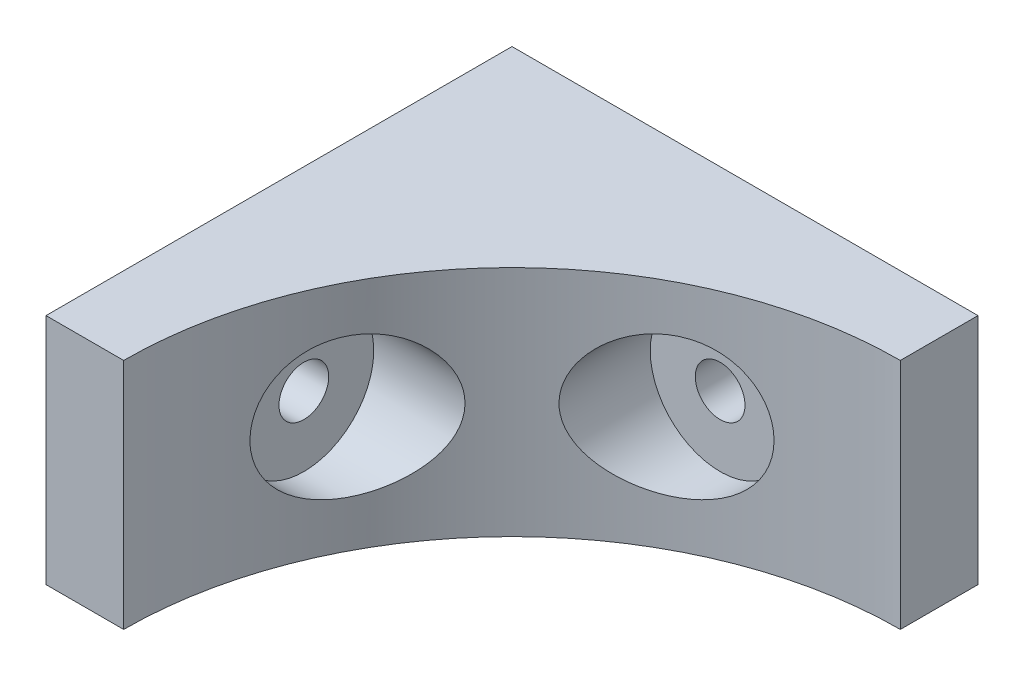
ISO-10303-21;
HEADER;
FILE_DESCRIPTION(('STEP AP214'),'2;1');
FILE_NAME('part.step','',(''),(''),'','','');
FILE_SCHEMA(('AUTOMOTIVE_DESIGN { 1 0 10303 214 1 1 1 1 }'));
ENDSEC;
DATA;
#1=APPLICATION_CONTEXT('core data for automotive mechanical design processes');
#2=APPLICATION_PROTOCOL_DEFINITION('international standard','automotive_design',2000,#1);
#3=PRODUCT_CONTEXT('',#1,'mechanical');
#4=PRODUCT('Part','Part','',(#3));
#5=PRODUCT_RELATED_PRODUCT_CATEGORY('part','',(#4));
#6=PRODUCT_DEFINITION_FORMATION('','',#4);
#7=PRODUCT_DEFINITION_CONTEXT('part definition',#1,'design');
#8=PRODUCT_DEFINITION('design','',#6,#7);
#9=PRODUCT_DEFINITION_SHAPE('','',#8);
#10=(LENGTH_UNIT() NAMED_UNIT(*) SI_UNIT(.MILLI.,.METRE.));
#11=(NAMED_UNIT(*) PLANE_ANGLE_UNIT() SI_UNIT($,.RADIAN.));
#12=(NAMED_UNIT(*) SI_UNIT($,.STERADIAN.) SOLID_ANGLE_UNIT());
#13=UNCERTAINTY_MEASURE_WITH_UNIT(LENGTH_MEASURE(1.E-05),#10,'distance_accuracy_value','');
#14=(GEOMETRIC_REPRESENTATION_CONTEXT(3) GLOBAL_UNCERTAINTY_ASSIGNED_CONTEXT((#13)) GLOBAL_UNIT_ASSIGNED_CONTEXT((#10,
#11,#12)) REPRESENTATION_CONTEXT('',''));
#15=CARTESIAN_POINT('',(0.,0.,0.));
#16=DIRECTION('',(0.,0.,1.));
#17=DIRECTION('',(1.,0.,0.));
#18=AXIS2_PLACEMENT_3D('',#15,#16,#17);
#19=CARTESIAN_POINT('',(0.,0.,0.));
#20=DIRECTION('',(0.,0.,1.));
#21=DIRECTION('',(1.,0.,0.));
#22=AXIS2_PLACEMENT_3D('',#19,#20,#21);
#23=PLANE('',#22);
#24=DIRECTION('',(0.,1.,0.));
#25=VECTOR('',#24,1.);
#26=CARTESIAN_POINT('',(15.,7.5,0.));
#27=LINE('',#26,#25);
#28=CARTESIAN_POINT('',(15.,-7.5,0.));
#29=VERTEX_POINT('',#28);
#30=CARTESIAN_POINT('',(15.,7.5,0.));
#31=VERTEX_POINT('',#30);
#32=EDGE_CURVE('E84',#29,#31,#27,.T.);
#33=ORIENTED_EDGE('',*,*,#32,.F.);
#34=DIRECTION('',(1.,0.,0.));
#35=VECTOR('',#34,1.);
#36=CARTESIAN_POINT('',(-15.,-7.5,0.));
#37=LINE('',#36,#35);
#38=CARTESIAN_POINT('',(-15.,-7.5,0.));
#39=VERTEX_POINT('',#38);
#40=EDGE_CURVE('E72',#39,#29,#37,.T.);
#41=ORIENTED_EDGE('',*,*,#40,.F.);
#42=DIRECTION('',(0.,-1.,0.));
#43=VECTOR('',#42,1.);
#44=CARTESIAN_POINT('',(-15.,7.5,0.));
#45=LINE('',#44,#43);
#46=CARTESIAN_POINT('',(-15.,7.5,0.));
#47=VERTEX_POINT('',#46);
#48=EDGE_CURVE('E69',#47,#39,#45,.T.);
#49=ORIENTED_EDGE('',*,*,#48,.F.);
#50=DIRECTION('',(-1.,0.,0.));
#51=VECTOR('',#50,1.);
#52=CARTESIAN_POINT('',(-15.,7.5,0.));
#53=LINE('',#52,#51);
#54=EDGE_CURVE('E89',#31,#47,#53,.T.);
#55=ORIENTED_EDGE('',*,*,#54,.F.);
#56=EDGE_LOOP('',(#33,#41,#49,#55));
#57=FACE_BOUND('',#56,.T.);
#58=CARTESIAN_POINT('',(3.40000000000001,0.,0.));
#59=DIRECTION('',(0.,0.,1.));
#60=DIRECTION('',(1.,0.,0.));
#61=AXIS2_PLACEMENT_3D('',#58,#59,#60);
#62=CIRCLE('',#61,1.6);
#63=CARTESIAN_POINT('',(5.00000000000001,0.,0.));
#64=VERTEX_POINT('',#63);
#65=EDGE_CURVE('E91',#64,#64,#62,.T.);
#66=ORIENTED_EDGE('',*,*,#65,.T.);
#67=EDGE_LOOP('',(#66));
#68=FACE_BOUND('',#67,.T.);
#69=ADVANCED_FACE('F32',(#57,#68),#23,.F.);
#70=CARTESIAN_POINT('',(15.,7.5,5.));
#71=DIRECTION('',(-1.,0.,0.));
#72=DIRECTION('',(0.,-1.,0.));
#73=AXIS2_PLACEMENT_3D('',#70,#71,#72);
#74=PLANE('',#73);
#75=ORIENTED_EDGE('',*,*,#32,.T.);
#76=DIRECTION('',(0.,0.,-1.));
#77=VECTOR('',#76,1.);
#78=CARTESIAN_POINT('',(15.,7.5,5.));
#79=LINE('',#78,#77);
#80=CARTESIAN_POINT('',(15.,7.5,5.));
#81=VERTEX_POINT('',#80);
#82=EDGE_CURVE('E103',#81,#31,#79,.T.);
#83=ORIENTED_EDGE('',*,*,#82,.F.);
#84=DIRECTION('',(0.,1.,0.));
#85=VECTOR('',#84,1.);
#86=CARTESIAN_POINT('',(15.,7.5,5.));
#87=LINE('',#86,#85);
#88=CARTESIAN_POINT('',(15.,-7.5,5.));
#89=VERTEX_POINT('',#88);
#90=EDGE_CURVE('E78',#89,#81,#87,.T.);
#91=ORIENTED_EDGE('',*,*,#90,.F.);
#92=DIRECTION('',(0.,0.,-1.));
#93=VECTOR('',#92,1.);
#94=CARTESIAN_POINT('',(15.,-7.5,5.));
#95=LINE('',#94,#93);
#96=EDGE_CURVE('E51',#89,#29,#95,.T.);
#97=ORIENTED_EDGE('',*,*,#96,.T.);
#98=EDGE_LOOP('',(#75,#83,#91,#97));
#99=FACE_BOUND('',#98,.T.);
#100=ADVANCED_FACE('F82',(#99),#74,.F.);
#101=CARTESIAN_POINT('',(-15.,7.5,5.));
#102=DIRECTION('',(0.,-1.,0.));
#103=DIRECTION('',(0.,0.,-1.));
#104=AXIS2_PLACEMENT_3D('',#101,#102,#103);
#105=PLANE('',#104);
#106=ORIENTED_EDGE('',*,*,#54,.T.);
#107=DIRECTION('',(0.,0.,-1.));
#108=VECTOR('',#107,1.);
#109=CARTESIAN_POINT('',(-15.,7.5,5.));
#110=LINE('',#109,#108);
#111=CARTESIAN_POINT('',(-15.,7.5,30.));
#112=VERTEX_POINT('',#111);
#113=EDGE_CURVE('E101',#112,#47,#110,.T.);
#114=ORIENTED_EDGE('',*,*,#113,.F.);
#115=DIRECTION('',(-1.,0.,0.));
#116=VECTOR('',#115,1.);
#117=CARTESIAN_POINT('',(-15.,7.5,30.));
#118=LINE('',#117,#116);
#119=CARTESIAN_POINT('',(-9.99999999999999,7.5,30.));
#120=VERTEX_POINT('',#119);
#121=EDGE_CURVE('E95',#120,#112,#118,.T.);
#122=ORIENTED_EDGE('',*,*,#121,.F.);
#123=CARTESIAN_POINT('',(15.,7.5,30.));
#124=DIRECTION('',(0.,-1.,0.));
#125=DIRECTION('',(0.,0.,-1.));
#126=AXIS2_PLACEMENT_3D('',#123,#124,#125);
#127=CIRCLE('',#126,25.);
#128=EDGE_CURVE('E43',#120,#81,#127,.T.);
#129=ORIENTED_EDGE('',*,*,#128,.T.);
#130=ORIENTED_EDGE('',*,*,#82,.T.);
#131=EDGE_LOOP('',(#106,#114,#122,#129,#130));
#132=FACE_BOUND('',#131,.T.);
#133=ADVANCED_FACE('F142',(#132),#105,.F.);
#134=CARTESIAN_POINT('',(-15.,7.5,5.));
#135=DIRECTION('',(1.,0.,0.));
#136=DIRECTION('',(0.,0.,-1.));
#137=AXIS2_PLACEMENT_3D('',#134,#135,#136);
#138=PLANE('',#137);
#139=CARTESIAN_POINT('',(-15.,0.,18.4));
#140=DIRECTION('',(1.,0.,0.));
#141=DIRECTION('',(0.,0.,-1.));
#142=AXIS2_PLACEMENT_3D('',#139,#140,#141);
#143=CIRCLE('',#142,1.6);
#144=CARTESIAN_POINT('',(-15.,0.,16.8));
#145=VERTEX_POINT('',#144);
#146=EDGE_CURVE('E259',#145,#145,#143,.F.);
#147=ORIENTED_EDGE('',*,*,#146,.F.);
#148=EDGE_LOOP('',(#147));
#149=FACE_BOUND('',#148,.T.);
#150=ORIENTED_EDGE('',*,*,#48,.T.);
#151=DIRECTION('',(0.,0.,-1.));
#152=VECTOR('',#151,1.);
#153=CARTESIAN_POINT('',(-15.,-7.5,5.));
#154=LINE('',#153,#152);
#155=CARTESIAN_POINT('',(-15.,-7.5,30.));
#156=VERTEX_POINT('',#155);
#157=EDGE_CURVE('E75',#156,#39,#154,.T.);
#158=ORIENTED_EDGE('',*,*,#157,.F.);
#159=DIRECTION('',(0.,-1.,0.));
#160=VECTOR('',#159,1.);
#161=CARTESIAN_POINT('',(-15.,7.5,30.));
#162=LINE('',#161,#160);
#163=EDGE_CURVE('E262',#112,#156,#162,.T.);
#164=ORIENTED_EDGE('',*,*,#163,.F.);
#165=ORIENTED_EDGE('',*,*,#113,.T.);
#166=EDGE_LOOP('',(#150,#158,#164,#165));
#167=FACE_BOUND('',#166,.T.);
#168=ADVANCED_FACE('F139',(#149,#167),#138,.F.);
#169=CARTESIAN_POINT('',(-15.,-7.5,5.));
#170=DIRECTION('',(0.,1.,0.));
#171=DIRECTION('',(0.,0.,1.));
#172=AXIS2_PLACEMENT_3D('',#169,#170,#171);
#173=PLANE('',#172);
#174=ORIENTED_EDGE('',*,*,#40,.T.);
#175=ORIENTED_EDGE('',*,*,#96,.F.);
#176=CARTESIAN_POINT('',(15.,-7.5,30.));
#177=DIRECTION('',(0.,1.,0.));
#178=DIRECTION('',(0.,0.,1.));
#179=AXIS2_PLACEMENT_3D('',#176,#177,#178);
#180=CIRCLE('',#179,25.);
#181=CARTESIAN_POINT('',(-9.99999999999999,-7.5,30.));
#182=VERTEX_POINT('',#181);
#183=EDGE_CURVE('E11',#89,#182,#180,.T.);
#184=ORIENTED_EDGE('',*,*,#183,.T.);
#185=DIRECTION('',(1.,0.,0.));
#186=VECTOR('',#185,1.);
#187=CARTESIAN_POINT('',(-15.,-7.5,30.));
#188=LINE('',#187,#186);
#189=EDGE_CURVE('E265',#156,#182,#188,.T.);
#190=ORIENTED_EDGE('',*,*,#189,.F.);
#191=ORIENTED_EDGE('',*,*,#157,.T.);
#192=EDGE_LOOP('',(#174,#175,#184,#190,#191));
#193=FACE_BOUND('',#192,.T.);
#194=ADVANCED_FACE('F73',(#193),#173,.F.);
#195=CARTESIAN_POINT('',(3.40000000000001,0.,5.));
#196=DIRECTION('',(0.,0.,-1.));
#197=DIRECTION('',(-1.,0.,0.));
#198=AXIS2_PLACEMENT_3D('',#195,#196,#197);
#199=CYLINDRICAL_SURFACE('',#198,1.6);
#200=CARTESIAN_POINT('',(3.40000000000001,0.,5.));
#201=DIRECTION('',(0.,0.,-1.));
#202=DIRECTION('',(-1.,0.,0.));
#203=AXIS2_PLACEMENT_3D('',#200,#201,#202);
#204=CIRCLE('',#203,1.6);
#205=CARTESIAN_POINT('',(1.80000000000001,0.,5.));
#206=VERTEX_POINT('',#205);
#207=EDGE_CURVE('E37',#206,#206,#204,.T.);
#208=ORIENTED_EDGE('',*,*,#207,.F.);
#209=EDGE_LOOP('',(#208));
#210=FACE_BOUND('',#209,.T.);
#211=ORIENTED_EDGE('',*,*,#65,.F.);
#212=EDGE_LOOP('',(#211));
#213=FACE_BOUND('',#212,.T.);
#214=ADVANCED_FACE('F130',(#210,#213),#199,.F.);
#215=CARTESIAN_POINT('',(0.,0.,30.));
#216=DIRECTION('',(0.,0.,1.));
#217=DIRECTION('',(1.,0.,0.));
#218=AXIS2_PLACEMENT_3D('',#215,#216,#217);
#219=PLANE('',#218);
#220=ORIENTED_EDGE('',*,*,#163,.T.);
#221=ORIENTED_EDGE('',*,*,#189,.T.);
#222=DIRECTION('',(0.,1.,0.));
#223=VECTOR('',#222,1.);
#224=CARTESIAN_POINT('',(-9.99999999999999,7.5,30.));
#225=LINE('',#224,#223);
#226=EDGE_CURVE('E268',#182,#120,#225,.T.);
#227=ORIENTED_EDGE('',*,*,#226,.T.);
#228=ORIENTED_EDGE('',*,*,#121,.T.);
#229=EDGE_LOOP('',(#220,#221,#227,#228));
#230=FACE_BOUND('',#229,.T.);
#231=ADVANCED_FACE('F126',(#230),#219,.T.);
#232=CARTESIAN_POINT('',(-15.001,0.,18.4));
#233=DIRECTION('',(1.,0.,0.));
#234=DIRECTION('',(0.,1.,0.));
#235=AXIS2_PLACEMENT_3D('',#232,#233,#234);
#236=CYLINDRICAL_SURFACE('',#235,1.6);
#237=CARTESIAN_POINT('',(-9.99999999999999,0.,18.4));
#238=DIRECTION('',(-1.,0.,0.));
#239=DIRECTION('',(0.,0.,1.));
#240=AXIS2_PLACEMENT_3D('',#237,#238,#239);
#241=CIRCLE('',#240,1.6);
#242=CARTESIAN_POINT('',(-9.99999999999999,0.,20.));
#243=VERTEX_POINT('',#242);
#244=EDGE_CURVE('E112',#243,#243,#241,.F.);
#245=ORIENTED_EDGE('',*,*,#244,.T.);
#246=EDGE_LOOP('',(#245));
#247=FACE_BOUND('',#246,.T.);
#248=ORIENTED_EDGE('',*,*,#146,.T.);
#249=EDGE_LOOP('',(#248));
#250=FACE_BOUND('',#249,.T.);
#251=ADVANCED_FACE('F123',(#247,#250),#236,.F.);
#252=CARTESIAN_POINT('',(15.,7.5,30.));
#253=DIRECTION('',(0.,1.,0.));
#254=DIRECTION('',(-1.,0.,0.));
#255=AXIS2_PLACEMENT_3D('',#252,#253,#254);
#256=CYLINDRICAL_SURFACE('',#255,25.);
#257=CARTESIAN_POINT('',(-1.09999999999999,0.,10.8743627557145));
#258=CARTESIAN_POINT('',(-1.10000304115119,0.107033824208161,10.874366034892));
#259=CARTESIAN_POINT('',(-1.09617673142939,0.214040190001089,10.8711425498611));
#260=CARTESIAN_POINT('',(-1.08095293154982,0.427164154300239,10.8583423417347));
#261=CARTESIAN_POINT('',(-1.06955369185851,0.533281541692708,10.848764150546));
#262=CARTESIAN_POINT('',(-1.03937921268732,0.743791089883333,10.823485749466));
#263=CARTESIAN_POINT('',(-1.02059904486891,0.84818204929081,10.8077814491467));
#264=CARTESIAN_POINT('',(-0.975996183943815,1.05442468851927,10.7706374568215));
#265=CARTESIAN_POINT('',(-0.950170306164407,1.15627519727598,10.7491951713207));
#266=CARTESIAN_POINT('',(-0.863115621781819,1.45558007057472,10.6772873667974));
#267=CARTESIAN_POINT('',(-0.792065870050735,1.64842687699252,10.6190327023482));
#268=CARTESIAN_POINT('',(-0.62733953658339,2.01782119825685,10.4859680826594));
#269=CARTESIAN_POINT('',(-0.533649747080253,2.19435911540272,10.4111484658851));
#270=CARTESIAN_POINT('',(-0.290118187577982,2.58926444212246,10.2201147957513));
#271=CARTESIAN_POINT('',(-0.132164982329981,2.80011141473429,10.0986520575415));
#272=CARTESIAN_POINT('',(0.21226853006321,3.18679030112557,9.84139541418907));
#273=CARTESIAN_POINT('',(0.398785586135075,3.36257642673132,9.70558311837844));
#274=CARTESIAN_POINT('',(0.797545083254923,3.68007211974351,9.42451792282614));
#275=CARTESIAN_POINT('',(1.01008360873149,3.82132156210178,9.27916718809814));
#276=CARTESIAN_POINT('',(1.45438475938664,4.0655767810075,8.98602122975888));
#277=CARTESIAN_POINT('',(1.68614688808944,4.16858354484828,8.83822606935712));
#278=CARTESIAN_POINT('',(2.19922508286938,4.34647420341836,8.52343807448762));
#279=CARTESIAN_POINT('',(2.48289193827603,4.41524353485176,8.3567168757278));
#280=CARTESIAN_POINT('',(2.91755032096318,4.47646472076095,8.11296406498902));
#281=CARTESIAN_POINT('',(3.06407590649063,4.48987727984809,8.03271026716654));
#282=CARTESIAN_POINT('',(3.35916350435927,4.50223323378579,7.8749280334923));
#283=CARTESIAN_POINT('',(3.50772444536408,4.50118396901818,7.7973982350547));
#284=CARTESIAN_POINT('',(3.80226272179719,4.48435577926476,7.64742999814957));
#285=CARTESIAN_POINT('',(3.94822078034991,4.46891657734999,7.57491543190433));
#286=CARTESIAN_POINT('',(4.23961229643579,4.42343515674817,7.43364789251625));
#287=CARTESIAN_POINT('',(4.38504597806678,4.3934001774035,7.36489307336919));
#288=CARTESIAN_POINT('',(4.67396147627975,4.31848167012088,7.23163975500926));
#289=CARTESIAN_POINT('',(4.81744410012128,4.27360449067476,7.16713945012597));
#290=CARTESIAN_POINT('',(5.10093444353572,4.16889012058301,7.04281272628281));
#291=CARTESIAN_POINT('',(5.2409426408205,4.10905499922915,6.98298566232493));
#292=CARTESIAN_POINT('',(5.50086792374679,3.98182900431401,6.87460004417617));
#293=CARTESIAN_POINT('',(5.62131655189222,3.91596258652748,6.82552317775535));
#294=CARTESIAN_POINT('',(5.85684795296231,3.77265086891398,6.7315913617759));
#295=CARTESIAN_POINT('',(5.97193139439657,3.69520701673692,6.68673588551295));
#296=CARTESIAN_POINT('',(6.19541104768885,3.52917081895324,6.60142060109248));
#297=CARTESIAN_POINT('',(6.3038103925129,3.44058375649681,6.56095872669542));
#298=CARTESIAN_POINT('',(6.51271374456183,3.25280382445974,6.48450840085713));
#299=CARTESIAN_POINT('',(6.61321841782728,3.15361185124193,6.44851957189419));
#300=CARTESIAN_POINT('',(6.79558855974935,2.95571435675198,6.38441125408612));
#301=CARTESIAN_POINT('',(6.87831394729878,2.85793757271955,6.35586524643398));
#302=CARTESIAN_POINT('',(7.03554287438835,2.6550508293289,6.30244068110259));
#303=CARTESIAN_POINT('',(7.11004708999947,2.5499414741293,6.27756182179749));
#304=CARTESIAN_POINT('',(7.25005803559487,2.33317336074301,6.23145283903326));
#305=CARTESIAN_POINT('',(7.31556699777517,2.22151623725272,6.21022181002556));
#306=CARTESIAN_POINT('',(7.43693399390392,1.99247569171781,6.17135975768703));
#307=CARTESIAN_POINT('',(7.49279226523626,1.87509241061409,6.1537286458049));
#308=CARTESIAN_POINT('',(7.59160159415654,1.64184734031309,6.12285256176318));
#309=CARTESIAN_POINT('',(7.63507805176042,1.52623187788673,6.1094252899036));
#310=CARTESIAN_POINT('',(7.7124643149943,1.29148341814893,6.08570586486997));
#311=CARTESIAN_POINT('',(7.74637091623013,1.17234925734312,6.07541476172658));
#312=CARTESIAN_POINT('',(7.80426789211352,0.931532975318515,6.05793754626891));
#313=CARTESIAN_POINT('',(7.82826300604952,0.809852101151644,6.05074994990347));
#314=CARTESIAN_POINT('',(7.86614524334396,0.564739436297642,6.03943848014307));
#315=CARTESIAN_POINT('',(7.88002866272853,0.441307020872253,6.03531572940787));
#316=CARTESIAN_POINT('',(7.89737282816205,0.1960848291769,6.03016965217262));
#317=CARTESIAN_POINT('',(7.90103269490267,0.0743103299317141,6.02908711027085));
#318=CARTESIAN_POINT('',(7.89846737887383,-0.169170351970822,6.02984696658174));
#319=CARTESIAN_POINT('',(7.8922386036942,-0.290876493725198,6.03169042777179));
#320=CARTESIAN_POINT('',(7.8699492278066,-0.53325291076709,6.03831160898974));
#321=CARTESIAN_POINT('',(7.85389273190445,-0.653923597213372,6.04308810396171));
#322=CARTESIAN_POINT('',(7.81208666751508,-0.893464295654398,6.05559820399344));
#323=CARTESIAN_POINT('',(7.78633352453779,-1.01233362678279,6.06333289955589));
#324=CARTESIAN_POINT('',(7.72546782238824,-1.24698429241465,6.08176035296147));
#325=CARTESIAN_POINT('',(7.69038722631271,-1.36277471449484,6.09244301343622));
#326=CARTESIAN_POINT('',(7.61112446527866,-1.59091771360137,6.11682104905434));
#327=CARTESIAN_POINT('',(7.56693898419522,-1.70326902088255,6.13051752199353));
#328=CARTESIAN_POINT('',(7.46988579670014,-1.92367425571101,6.16095716568781));
#329=CARTESIAN_POINT('',(7.41702151633677,-2.03172985820869,6.17769913448168));
#330=CARTESIAN_POINT('',(7.30304885484996,-2.24290291190345,6.21427895176672));
#331=CARTESIAN_POINT('',(7.24193742014829,-2.34601851477096,6.23411794738665));
#332=CARTESIAN_POINT('',(7.1114523504217,-2.54747756926114,6.27710876289044));
#333=CARTESIAN_POINT('',(7.04201145401952,-2.64577169309495,6.30028790510586));
#334=CARTESIAN_POINT('',(6.89592156568786,-2.8360083302637,6.34984404511075));
#335=CARTESIAN_POINT('',(6.81926995903811,-2.92794851843257,6.37622220392591));
#336=CARTESIAN_POINT('',(6.57953531936915,-3.19331115758157,6.46015413155214));
#337=CARTESIAN_POINT('',(6.40654386227352,-3.35647270443428,6.52254684834567));
#338=CARTESIAN_POINT('',(6.03500316606209,-3.65587347119414,6.66184935874162));
#339=CARTESIAN_POINT('',(5.8358574803734,-3.79119294983537,6.73912820665987));
#340=CARTESIAN_POINT('',(5.42267541288994,-4.02683010268509,6.90618043732879));
#341=CARTESIAN_POINT('',(5.20863568243417,-4.12713987488916,6.99595663445506));
#342=CARTESIAN_POINT('',(4.75851825653455,-4.29719071921385,7.19263335402733));
#343=CARTESIAN_POINT('',(4.52189661097006,-4.36465444024379,7.30024999673614));
#344=CARTESIAN_POINT('',(4.04581817336187,-4.46003731088195,7.52611664798638));
#345=CARTESIAN_POINT('',(3.80636027809901,-4.48794052677809,7.64437092064566));
#346=CARTESIAN_POINT('',(3.30717864381684,-4.50662608171773,7.90103922729803));
#347=CARTESIAN_POINT('',(3.04774540034887,-4.49353992516368,8.04029575996089));
#348=CARTESIAN_POINT('',(2.53839841985063,-4.42422623201875,8.32527257716342));
#349=CARTESIAN_POINT('',(2.28848832723727,-4.36798235001532,8.47099529097701));
#350=CARTESIAN_POINT('',(1.77787560406086,-4.20686115695437,8.7803511726832));
#351=CARTESIAN_POINT('',(1.51874811020971,-4.09753921031976,8.944272535494));
#352=CARTESIAN_POINT('',(1.02346902214733,-3.83160230215022,9.26972310985488));
#353=CARTESIAN_POINT('',(0.787348250296506,-3.67492501955111,9.43124887305377));
#354=CARTESIAN_POINT('',(0.451538656018055,-3.40270104064406,9.66868962023504));
#355=CARTESIAN_POINT('',(0.340884535441757,-3.30365496680213,9.74839006775148));
#356=CARTESIAN_POINT('',(0.128496409526192,-3.09347426268724,9.90384000369191));
#357=CARTESIAN_POINT('',(0.0267641571692761,-2.98233726633941,9.97958871449336));
#358=CARTESIAN_POINT('',(-0.166343734400248,-2.74847728695361,10.1254774854698));
#359=CARTESIAN_POINT('',(-0.257741137029492,-2.62577968733132,10.1956292364956));
#360=CARTESIAN_POINT('',(-0.428990336147652,-2.36910287599311,10.3287515600705));
#361=CARTESIAN_POINT('',(-0.508849602375566,-2.23513105287989,10.3917267730486));
#362=CARTESIAN_POINT('',(-0.677165819000262,-1.91524866957139,10.5258832261459));
#363=CARTESIAN_POINT('',(-0.76124144120221,-1.72565254109051,10.5940289549331));
#364=CARTESIAN_POINT('',(-0.867951014170134,-1.43023650262671,10.6813497907014));
#365=CARTESIAN_POINT('',(-0.900274454037228,-1.32998561967502,10.7079632374513));
#366=CARTESIAN_POINT('',(-0.958065200790327,-1.12626241873082,10.7557396591305));
#367=CARTESIAN_POINT('',(-0.983534004943187,-1.02279080976362,10.7769038243094));
#368=CARTESIAN_POINT('',(-1.03649315894551,-0.768628469339121,10.821038608528));
#369=CARTESIAN_POINT('',(-1.06022745340015,-0.616590141136883,10.8409418995776));
#370=CARTESIAN_POINT('',(-1.09198005072789,-0.30968238793569,10.8676027527724));
#371=CARTESIAN_POINT('',(-1.09999560131445,-0.154812471928173,10.8743580127506));
#372=CARTESIAN_POINT('',(-1.09999999999999,0.,10.8743627557145));
#373=B_SPLINE_CURVE_WITH_KNOTS('',3,(#257,#258,#259,#260,#261,#262,#263,#264,#265,#266,#267,
#268,#269,#270,#271,#272,#273,#274,#275,#276,#277,#278,#279,#280,#281,#282,#283,#284,#285,#286,
#287,#288,#289,#290,#291,#292,#293,#294,#295,#296,#297,#298,#299,#300,#301,#302,#303,#304,#305,
#306,#307,#308,#309,#310,#311,#312,#313,#314,#315,#316,#317,#318,#319,#320,#321,#322,#323,#324,
#325,#326,#327,#328,#329,#330,#331,#332,#333,#334,#335,#336,#337,#338,#339,#340,#341,#342,#343,
#344,#345,#346,#347,#348,#349,#350,#351,#352,#353,#354,#355,#356,#357,#358,#359,#360,#361,#362,
#363,#364,#365,#366,#367,#368,#369,#370,#371,#372),.UNSPECIFIED.,.T.,.F.,(4,2,2,2,2,2,2,2,2,2,2,
2,2,2,2,2,2,2,2,2,2,2,2,2,2,2,2,2,2,2,2,2,2,2,2,2,2,2,2,2,2,2,2,2,2,2,2,2,2,2,2,2,2,2,2,2,2,4),
(0.,0.32093790284116,0.641949976046546,0.963176758205213,1.2845489766582,1.92234871054113,
2.56052142673972,3.42617271833496,4.29294722102612,5.17070727270549,6.04844466208849,
7.05149427367947,7.55377152625312,8.0557938475661,8.54625654861724,9.03647623355493,
9.52648650618449,10.0164290279393,10.4532065212249,10.8899294451797,11.3264460877137,
11.7629258635142,12.1560868203414,12.5492154213046,12.9422462893743,13.335267488448,
13.7075582972483,14.0799736173236,14.452210656134,14.8245839791026,15.189652386017,
15.5548534477088,15.9199020775721,16.2850854078366,16.6490331139424,17.0131136098695,
17.3770507252298,17.7411229629753,18.1083629204415,18.4757365621873,19.2097757673744,
19.9651379087067,20.7206704319515,21.5229844894865,22.3256216018704,23.2062131832,
24.0871384415528,25.0595629089894,26.0332727303869,26.5383135588751,27.0434533972766,
27.5475088677696,28.0512365385338,28.7031432635382,29.0287390250808,29.3542636084971,
29.81838318071,30.2825840110723),.UNSPECIFIED.);
#374=CARTESIAN_POINT('',(-1.09999999999999,0.,10.8743627557145));
#375=VERTEX_POINT('',#374);
#376=EDGE_CURVE('E247',#375,#375,#373,.T.);
#377=ORIENTED_EDGE('',*,*,#376,.T.);
#378=EDGE_LOOP('',(#377));
#379=FACE_BOUND('',#378,.T.);
#380=CARTESIAN_POINT('',(-8.97060700107528,0.,22.9));
#381=CARTESIAN_POINT('',(-8.9706069821847,0.121727491954283,22.8999992611048));
#382=CARTESIAN_POINT('',(-8.96914407273578,0.243493170320762,22.8950551483617));
#383=CARTESIAN_POINT('',(-8.96328372489157,0.486204870385953,22.8753150102198));
#384=CARTESIAN_POINT('',(-8.95888453145522,0.607150358150446,22.8605130927418));
#385=CARTESIAN_POINT('',(-8.94711808074488,0.847548509167182,22.821145043714));
#386=CARTESIAN_POINT('',(-8.93974492909926,0.966997719165166,22.7965595224113));
#387=CARTESIAN_POINT('',(-8.92199569239111,1.20334285373039,22.7378335189292));
#388=CARTESIAN_POINT('',(-8.91161845433396,1.32023777937939,22.7036893682305));
#389=CARTESIAN_POINT('',(-8.88784370531303,1.55040042783197,22.6262248358724));
#390=CARTESIAN_POINT('',(-8.87445149960523,1.66367412761191,22.5829205806834));
#391=CARTESIAN_POINT('',(-8.84458865745825,1.88606142795757,22.4874710356542));
#392=CARTESIAN_POINT('',(-8.82811689034388,1.99517348278356,22.4353224992504));
#393=CARTESIAN_POINT('',(-8.79207483889796,2.2083484671338,22.3227176633868));
#394=CARTESIAN_POINT('',(-8.77250757037649,2.31241618353312,22.2622694574217));
#395=CARTESIAN_POINT('',(-8.73022185391331,2.51496891902518,22.133542090648));
#396=CARTESIAN_POINT('',(-8.70750223642001,2.61345184691598,22.065260025038));
#397=CARTESIAN_POINT('',(-8.65867875451774,2.80502815614195,21.9208429242151));
#398=CARTESIAN_POINT('',(-8.63254640982931,2.89806538547869,21.8446430496193));
#399=CARTESIAN_POINT('',(-8.57704562718099,3.07725485333827,21.6855536819744));
#400=CARTESIAN_POINT('',(-8.54767601865846,3.16340458185371,21.6026617720694));
#401=CARTESIAN_POINT('',(-8.48573477079325,3.328287207199,21.430951764155));
#402=CARTESIAN_POINT('',(-8.45316379909225,3.40702164380323,21.3421349030254));
#403=CARTESIAN_POINT('',(-8.38484999720568,3.55673184422347,21.1592804793181));
#404=CARTESIAN_POINT('',(-8.34910597946217,3.62770468078028,21.06524096706));
#405=CARTESIAN_POINT('',(-8.27322305440506,3.76390095957454,20.8693653881076));
#406=CARTESIAN_POINT('',(-8.23297422109194,3.82883684594692,20.7673717103588));
#407=CARTESIAN_POINT('',(-8.14928147528971,3.94982543099895,20.5594829588982));
#408=CARTESIAN_POINT('',(-8.10583640156913,4.0058748775646,20.4535864742939));
#409=CARTESIAN_POINT('',(-7.97092992192754,4.16041998134521,20.1313443417614));
#410=CARTESIAN_POINT('',(-7.87484086838545,4.24541348465451,19.9102989934105));
#411=CARTESIAN_POINT('',(-7.66484985924414,4.38374970712757,19.4466180824947));
#412=CARTESIAN_POINT('',(-7.55017023996085,4.43444431173682,19.2035578118406));
#413=CARTESIAN_POINT('',(-7.31085223188825,4.49548766240592,18.7172967600559));
#414=CARTESIAN_POINT('',(-7.18621026291694,4.50582183695769,18.4740959598768));
#415=CARTESIAN_POINT('',(-6.91645447734322,4.48710900592928,17.9684057151691));
#416=CARTESIAN_POINT('',(-6.77055147720695,4.45391962864356,17.7064922717744));
#417=CARTESIAN_POINT('',(-6.47368174276996,4.3435560043114,17.1949760286706));
#418=CARTESIAN_POINT('',(-6.32271121697241,4.26634809988713,16.9453828080923));
#419=CARTESIAN_POINT('',(-6.00529174662351,4.06075500304644,16.4399422865973));
#420=CARTESIAN_POINT('',(-5.8387709722199,3.92810842469527,16.1858644430377));
#421=CARTESIAN_POINT('',(-5.51166711056975,3.61492046266721,15.7046839366307));
#422=CARTESIAN_POINT('',(-5.35108265462149,3.43439019871569,15.4775750286619));
#423=CARTESIAN_POINT('',(-5.07264556754902,3.06425544791464,15.0958319454392));
#424=CARTESIAN_POINT('',(-4.9523451608286,2.88233071503094,14.9355367999263));
#425=CARTESIAN_POINT('',(-4.7278901668414,2.48863424450364,14.6427780954087));
#426=CARTESIAN_POINT('',(-4.62371178433311,2.27690739250797,14.5102734144625));
#427=CARTESIAN_POINT('',(-4.45709259130396,1.8696904611505,14.3017242058439));
#428=CARTESIAN_POINT('',(-4.39047561865921,1.67901554770225,14.2197136194072));
#429=CARTESIAN_POINT('',(-4.3056136467528,1.38204210870047,14.1161949523857));
#430=CARTESIAN_POINT('',(-4.2798332116926,1.28120259766946,14.0849339130039));
#431=CARTESIAN_POINT('',(-4.23381583703301,1.07641285526294,14.0293508378038));
#432=CARTESIAN_POINT('',(-4.21357649128103,0.972463995906408,14.005025789922));
#433=CARTESIAN_POINT('',(-4.17898813351663,0.761394577436837,13.9635680343236));
#434=CARTESIAN_POINT('',(-4.16468149270021,0.654256869076043,13.9464870444399));
#435=CARTESIAN_POINT('',(-4.14253729108439,0.43841025126641,13.9200881604965));
#436=CARTESIAN_POINT('',(-4.13469677405968,0.32970208296729,13.9107667188569));
#437=CARTESIAN_POINT('',(-4.12568940598512,0.111626942954712,13.9000604220323));
#438=CARTESIAN_POINT('',(-4.12452201367252,0.00226002539331864,13.8986749231564));
#439=CARTESIAN_POINT('',(-4.12889202132287,-0.216142942128331,13.9038668747739));
#440=CARTESIAN_POINT('',(-4.13442892584117,-0.325179015940872,13.9104437368523));
#441=CARTESIAN_POINT('',(-4.15113384607449,-0.530645045106839,13.9303322989913));
#442=CARTESIAN_POINT('',(-4.16165449156894,-0.627203951339184,13.9428702335153));
#443=CARTESIAN_POINT('',(-4.18772129106746,-0.818657248842031,13.974028652638));
#444=CARTESIAN_POINT('',(-4.20326902530679,-0.913551106812914,13.9926510498705));
#445=CARTESIAN_POINT('',(-4.25700916088571,-1.19481318430835,14.0572654942644));
#446=CARTESIAN_POINT('',(-4.30231109785851,-1.37790871547605,14.1120195200172));
#447=CARTESIAN_POINT('',(-4.41159673258451,-1.74109165058343,14.2457088563375));
#448=CARTESIAN_POINT('',(-4.47645902373422,-1.92047960019853,14.3257927826259));
#449=CARTESIAN_POINT('',(-4.61986605217591,-2.26311972081423,14.5056755618909));
#450=CARTESIAN_POINT('',(-4.69841713477093,-2.4263643534914,14.605483560653));
#451=CARTESIAN_POINT('',(-4.88178938344801,-2.76530783305953,14.8427911091636));
#452=CARTESIAN_POINT('',(-4.98875610682816,-2.93734697045521,14.9838476546058));
#453=CARTESIAN_POINT('',(-5.21214233389911,-3.25586181836431,15.2859023518419));
#454=CARTESIAN_POINT('',(-5.32856874690648,-3.40231859319021,15.4469151255075));
#455=CARTESIAN_POINT('',(-5.59242664184902,-3.697643476791,15.8220203697665));
#456=CARTESIAN_POINT('',(-5.74115708194151,-3.84030684090735,16.0400945661044));
#457=CARTESIAN_POINT('',(-6.04107467517661,-4.08574952199305,16.4963821829846));
#458=CARTESIAN_POINT('',(-6.19226349434507,-4.18850050765998,16.7346097636114));
#459=CARTESIAN_POINT('',(-6.42617811231245,-4.3159722515753,17.1180340841155));
#460=CARTESIAN_POINT('',(-6.50976815668123,-4.35513576453061,17.2580628043111));
#461=CARTESIAN_POINT('',(-6.67548386152371,-4.41985571920796,17.5420560816295));
#462=CARTESIAN_POINT('',(-6.75761001157891,-4.44541679587143,17.6860192805024));
#463=CARTESIAN_POINT('',(-6.91975249456573,-4.4824779239174,17.9770128613581));
#464=CARTESIAN_POINT('',(-6.9997677199828,-4.49397073237711,18.1240447836625));
#465=CARTESIAN_POINT('',(-7.15695399332532,-4.50238764771147,18.4199553964388));
#466=CARTESIAN_POINT('',(-7.23412647979044,-4.4993192281205,18.568833100438));
#467=CARTESIAN_POINT('',(-7.38301802090018,-4.47845749559734,18.8632596722231));
#468=CARTESIAN_POINT('',(-7.45482787646598,-4.46106189080216,19.0087905483925));
#469=CARTESIAN_POINT('',(-7.59463568022082,-4.41171345989921,19.2991410102135));
#470=CARTESIAN_POINT('',(-7.66263551431148,-4.37976790856924,19.44396091481));
#471=CARTESIAN_POINT('',(-7.7943455690962,-4.30109322446036,19.7314653612164));
#472=CARTESIAN_POINT('',(-7.85805740868648,-4.25436970938128,19.8741506929129));
#473=CARTESIAN_POINT('',(-7.98078188414306,-4.14605205478569,20.1558515031677));
#474=CARTESIAN_POINT('',(-8.03979516857371,-4.0844599723985,20.2948674864469));
#475=CARTESIAN_POINT('',(-8.14657195502988,-3.95409326850568,20.5525935335904));
#476=CARTESIAN_POINT('',(-8.19485965285823,-3.8868445191208,20.6718598276132));
#477=CARTESIAN_POINT('',(-8.28722307559027,-3.74090869952319,20.9048943880753));
#478=CARTESIAN_POINT('',(-8.33129932085455,-3.66222304547366,21.0186633328976));
#479=CARTESIAN_POINT('',(-8.41507151471133,-3.49387208770027,21.2393859935799));
#480=CARTESIAN_POINT('',(-8.45476998080267,-3.40421315755647,21.3463436112708));
#481=CARTESIAN_POINT('',(-8.5297224443767,-3.21446735162572,21.5522683880495));
#482=CARTESIAN_POINT('',(-8.5649768171938,-3.1143813577822,21.6512362216757));
#483=CARTESIAN_POINT('',(-8.62776222171086,-2.91484187669,21.8307288849454));
#484=CARTESIAN_POINT('',(-8.6557116159242,-2.81628898984133,21.912110573023));
#485=CARTESIAN_POINT('',(-8.70796672578978,-2.61199163846154,22.066591915651));
#486=CARTESIAN_POINT('',(-8.73227271035866,-2.50624770553305,22.139692181348));
#487=CARTESIAN_POINT('',(-8.77727599489023,-2.28829218836956,22.2768941411943));
#488=CARTESIAN_POINT('',(-8.79797198453899,-2.1760782753185,22.3409925663222));
#489=CARTESIAN_POINT('',(-8.8357864303722,-1.94607360084521,22.4594989129619));
#490=CARTESIAN_POINT('',(-8.85290510830895,-1.8282831856577,22.5139074351059));
#491=CARTESIAN_POINT('',(-8.88284664770789,-1.59407572072157,22.6100040024729));
#492=CARTESIAN_POINT('',(-8.89584185664628,-1.4778859051824,22.652193045588));
#493=CARTESIAN_POINT('',(-8.91869615559063,-1.24215012304885,22.7269330174473));
#494=CARTESIAN_POINT('',(-8.92855544167575,-1.1226043667995,22.7594845487853));
#495=CARTESIAN_POINT('',(-8.94515900601419,-0.881317024898348,22.8145851524805));
#496=CARTESIAN_POINT('',(-8.95191046822954,-0.759581186165398,22.8371572881099));
#497=CARTESIAN_POINT('',(-8.96235968264359,-0.514587791835973,22.8721913653813));
#498=CARTESIAN_POINT('',(-8.96605930319726,-0.391331214230122,22.8846594926728));
#499=CARTESIAN_POINT('',(-8.96903156435052,-0.223207616578648,22.894682981652));
#500=CARTESIAN_POINT('',(-8.96962235455171,-0.178593082374105,22.8966764062078));
#501=CARTESIAN_POINT('',(-8.97041007709857,-0.0893207458001097,22.8993350533599));
#502=CARTESIAN_POINT('',(-8.97060700800641,-0.0446629432732981,22.9000002711075));
#503=CARTESIAN_POINT('',(-8.97060700107528,0.,22.9));
#504=B_SPLINE_CURVE_WITH_KNOTS('',3,(#380,#381,#382,#383,#384,#385,#386,#387,#388,#389,#390,
#391,#392,#393,#394,#395,#396,#397,#398,#399,#400,#401,#402,#403,#404,#405,#406,#407,#408,#409,
#410,#411,#412,#413,#414,#415,#416,#417,#418,#419,#420,#421,#422,#423,#424,#425,#426,#427,#428,
#429,#430,#431,#432,#433,#434,#435,#436,#437,#438,#439,#440,#441,#442,#443,#444,#445,#446,#447,
#448,#449,#450,#451,#452,#453,#454,#455,#456,#457,#458,#459,#460,#461,#462,#463,#464,#465,#466,
#467,#468,#469,#470,#471,#472,#473,#474,#475,#476,#477,#478,#479,#480,#481,#482,#483,#484,#485,
#486,#487,#488,#489,#490,#491,#492,#493,#494,#495,#496,#497,#498,#499,#500,#501,#502,#503),
.UNSPECIFIED.,.T.,.F.,(4,2,2,2,2,2,2,2,2,2,2,2,2,2,2,2,2,2,2,2,2,2,2,2,2,2,2,2,2,2,2,2,2,2,2,2,
2,2,2,2,2,2,2,2,2,2,2,2,2,2,2,2,2,2,2,2,2,2,2,2,2,4),(0.,0.36513971953223,0.730497881748916,
1.09658376866871,1.46281034926174,1.82839747136882,2.19411908501679,2.55948656203203,
2.92498995815334,3.29376598057297,3.66267578893025,4.03150882403417,4.40048048690972,
4.78234498898207,5.16434891860712,5.92780175366053,6.74497817669473,7.56244960136006,
8.4636572291974,9.36555486293343,10.3555263352148,11.345268113658,12.1542378709084,
12.962002004478,13.6131022073384,13.9387841704104,14.2643244848124,14.5921513391187,
14.9198282321548,15.2474785466652,15.5751046494354,15.8685684184943,16.1621245259637,
16.7487977496913,17.3672312971427,17.9859522795613,18.7238741385045,19.462339902897,
20.3590043158118,21.2563040566652,21.7589402426466,22.261405048782,22.7641284357996,
23.2665938285021,23.7555635487512,24.2442890586336,24.7328290070869,25.2213014026664,
25.656265287607,26.0911753593936,26.5258340117162,26.9604559294797,27.3524537719315,
27.7444226671299,28.1365335399133,28.5286200991043,28.9010486650008,29.273453939558,
29.6449939949869,30.0163064222972,30.1502790753434,30.2842522174699),.UNSPECIFIED.);
#505=CARTESIAN_POINT('',(-8.97060700107528,0.,22.9));
#506=VERTEX_POINT('',#505);
#507=EDGE_CURVE('E106',#506,#506,#504,.T.);
#508=ORIENTED_EDGE('',*,*,#507,.T.);
#509=EDGE_LOOP('',(#508));
#510=FACE_BOUND('',#509,.T.);
#511=ORIENTED_EDGE('',*,*,#183,.F.);
#512=ORIENTED_EDGE('',*,*,#90,.T.);
#513=ORIENTED_EDGE('',*,*,#128,.F.);
#514=ORIENTED_EDGE('',*,*,#226,.F.);
#515=EDGE_LOOP('',(#511,#512,#513,#514));
#516=FACE_BOUND('',#515,.T.);
#517=ADVANCED_FACE('F34',(#379,#510,#516),#256,.F.);
#518=CARTESIAN_POINT('',(-9.99999999999999,0.,18.4));
#519=DIRECTION('',(-1.,0.,0.));
#520=DIRECTION('',(0.,0.,1.));
#521=AXIS2_PLACEMENT_3D('',#518,#519,#520);
#522=PLANE('',#521);
#523=CARTESIAN_POINT('',(-9.99999999999999,0.,18.4));
#524=DIRECTION('',(-1.,0.,0.));
#525=DIRECTION('',(0.,0.,1.));
#526=AXIS2_PLACEMENT_3D('',#523,#524,#525);
#527=CIRCLE('',#526,4.5);
#528=CARTESIAN_POINT('',(-9.99999999999999,0.,22.9));
#529=VERTEX_POINT('',#528);
#530=EDGE_CURVE('E113',#529,#529,#527,.T.);
#531=ORIENTED_EDGE('',*,*,#530,.F.);
#532=EDGE_LOOP('',(#531));
#533=FACE_BOUND('',#532,.T.);
#534=ORIENTED_EDGE('',*,*,#244,.F.);
#535=EDGE_LOOP('',(#534));
#536=FACE_BOUND('',#535,.T.);
#537=ADVANCED_FACE('F120',(#533,#536),#522,.F.);
#538=CARTESIAN_POINT('',(15.,0.,18.4));
#539=DIRECTION('',(-1.,0.,0.));
#540=DIRECTION('',(0.,0.,1.));
#541=AXIS2_PLACEMENT_3D('',#538,#539,#540);
#542=CYLINDRICAL_SURFACE('',#541,4.5);
#543=ORIENTED_EDGE('',*,*,#530,.T.);
#544=EDGE_LOOP('',(#543));
#545=FACE_BOUND('',#544,.T.);
#546=ORIENTED_EDGE('',*,*,#507,.F.);
#547=EDGE_LOOP('',(#546));
#548=FACE_BOUND('',#547,.T.);
#549=ADVANCED_FACE('F114',(#545,#548),#542,.F.);
#550=CARTESIAN_POINT('',(3.40000000000001,0.,30.));
#551=DIRECTION('',(0.,0.,-1.));
#552=DIRECTION('',(-1.,0.,0.));
#553=AXIS2_PLACEMENT_3D('',#550,#551,#552);
#554=CYLINDRICAL_SURFACE('',#553,4.5);
#555=CARTESIAN_POINT('',(3.40000000000001,0.,5.));
#556=DIRECTION('',(0.,0.,-1.));
#557=DIRECTION('',(-1.,0.,0.));
#558=AXIS2_PLACEMENT_3D('',#555,#556,#557);
#559=CIRCLE('',#558,4.5);
#560=CARTESIAN_POINT('',(-1.09999999999999,0.,5.));
#561=VERTEX_POINT('',#560);
#562=EDGE_CURVE('E251',#561,#561,#559,.T.);
#563=ORIENTED_EDGE('',*,*,#562,.T.);
#564=EDGE_LOOP('',(#563));
#565=FACE_BOUND('',#564,.T.);
#566=ORIENTED_EDGE('',*,*,#376,.F.);
#567=EDGE_LOOP('',(#566));
#568=FACE_BOUND('',#567,.T.);
#569=ADVANCED_FACE('F119',(#565,#568),#554,.F.);
#570=CARTESIAN_POINT('',(3.40000000000001,0.,5.));
#571=DIRECTION('',(0.,0.,-1.));
#572=DIRECTION('',(-1.,0.,0.));
#573=AXIS2_PLACEMENT_3D('',#570,#571,#572);
#574=PLANE('',#573);
#575=ORIENTED_EDGE('',*,*,#207,.T.);
#576=EDGE_LOOP('',(#575));
#577=FACE_BOUND('',#576,.T.);
#578=ORIENTED_EDGE('',*,*,#562,.F.);
#579=EDGE_LOOP('',(#578));
#580=FACE_BOUND('',#579,.T.);
#581=ADVANCED_FACE('F197',(#577,#580),#574,.F.);
#582=CLOSED_SHELL('',(#69,#100,#133,#168,#194,#214,#231,#251,#517,#537,#549,#569,#581));
#583=MANIFOLD_SOLID_BREP('B2',#582);
#584=ADVANCED_BREP_SHAPE_REPRESENTATION('',(#18,#583),#14);
#585=SHAPE_DEFINITION_REPRESENTATION(#9,#584);
ENDSEC;
END-ISO-10303-21;
